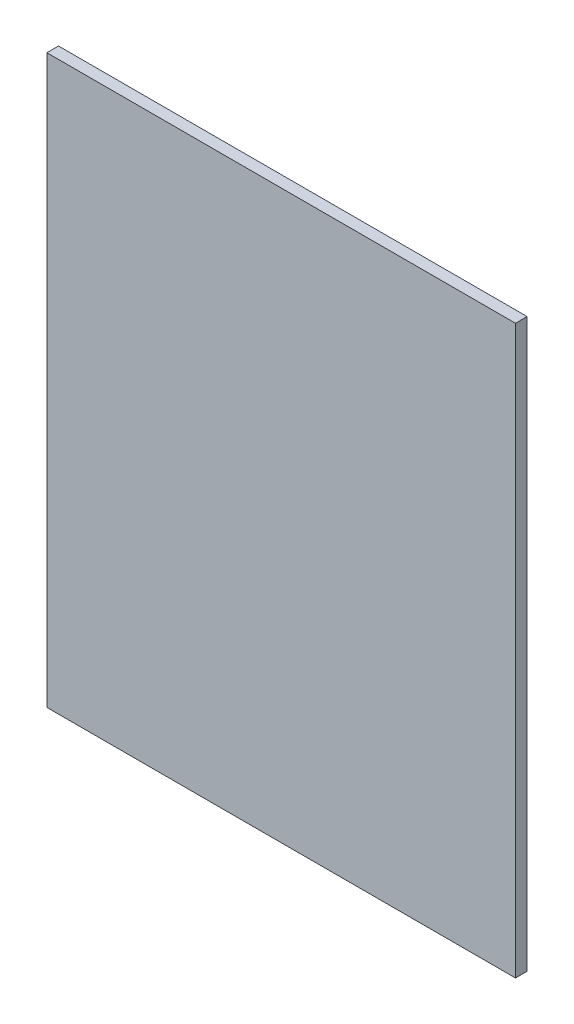
ISO-10303-21;
HEADER;
FILE_DESCRIPTION(('STEP AP214'),'2;1');
FILE_NAME('part.step','',(''),(''),'','','');
FILE_SCHEMA(('AUTOMOTIVE_DESIGN { 1 0 10303 214 1 1 1 1 }'));
ENDSEC;
DATA;
#1=APPLICATION_CONTEXT('core data for automotive mechanical design processes');
#2=APPLICATION_PROTOCOL_DEFINITION('international standard','automotive_design',2000,#1);
#3=PRODUCT_CONTEXT('',#1,'mechanical');
#4=PRODUCT('Part','Part','',(#3));
#5=PRODUCT_RELATED_PRODUCT_CATEGORY('part','',(#4));
#6=PRODUCT_DEFINITION_FORMATION('','',#4);
#7=PRODUCT_DEFINITION_CONTEXT('part definition',#1,'design');
#8=PRODUCT_DEFINITION('design','',#6,#7);
#9=PRODUCT_DEFINITION_SHAPE('','',#8);
#10=(LENGTH_UNIT() NAMED_UNIT(*) SI_UNIT(.MILLI.,.METRE.));
#11=(NAMED_UNIT(*) PLANE_ANGLE_UNIT() SI_UNIT($,.RADIAN.));
#12=(NAMED_UNIT(*) SI_UNIT($,.STERADIAN.) SOLID_ANGLE_UNIT());
#13=UNCERTAINTY_MEASURE_WITH_UNIT(LENGTH_MEASURE(1.E-05),#10,'distance_accuracy_value','');
#14=(GEOMETRIC_REPRESENTATION_CONTEXT(3) GLOBAL_UNCERTAINTY_ASSIGNED_CONTEXT((#13)) GLOBAL_UNIT_ASSIGNED_CONTEXT((#10,
#11,#12)) REPRESENTATION_CONTEXT('',''));
#15=CARTESIAN_POINT('',(0.,0.,0.));
#16=DIRECTION('',(0.,0.,1.));
#17=DIRECTION('',(1.,0.,0.));
#18=AXIS2_PLACEMENT_3D('',#15,#16,#17);
#19=CARTESIAN_POINT('',(797.573677161779,532.387927429448,3.));
#20=DIRECTION('',(1.,0.,0.));
#21=DIRECTION('',(0.,0.,-1.));
#22=AXIS2_PLACEMENT_3D('',#19,#20,#21);
#23=PLANE('',#22);
#24=DIRECTION('',(0.,-1.,0.));
#25=VECTOR('',#24,1.);
#26=CARTESIAN_POINT('',(797.573677161779,532.387927429448,0.));
#27=LINE('',#26,#25);
#28=CARTESIAN_POINT('',(797.573677161779,678.788447429448,0.));
#29=VERTEX_POINT('',#28);
#30=CARTESIAN_POINT('',(797.573677161779,532.387927429448,0.));
#31=VERTEX_POINT('',#30);
#32=EDGE_CURVE('E104',#29,#31,#27,.T.);
#33=ORIENTED_EDGE('',*,*,#32,.T.);
#34=DIRECTION('',(0.,0.,-1.));
#35=VECTOR('',#34,1.);
#36=CARTESIAN_POINT('',(797.573677161779,532.387927429448,3.));
#37=LINE('',#36,#35);
#38=CARTESIAN_POINT('',(797.573677161779,532.387927429448,3.));
#39=VERTEX_POINT('',#38);
#40=EDGE_CURVE('E11',#39,#31,#37,.T.);
#41=ORIENTED_EDGE('',*,*,#40,.F.);
#42=DIRECTION('',(0.,-1.,0.));
#43=VECTOR('',#42,1.);
#44=CARTESIAN_POINT('',(797.573677161779,532.387927429448,3.));
#45=LINE('',#44,#43);
#46=CARTESIAN_POINT('',(797.573677161779,678.788447429448,3.));
#47=VERTEX_POINT('',#46);
#48=EDGE_CURVE('E92',#47,#39,#45,.T.);
#49=ORIENTED_EDGE('',*,*,#48,.F.);
#50=DIRECTION('',(0.,0.,-1.));
#51=VECTOR('',#50,1.);
#52=CARTESIAN_POINT('',(797.573677161779,678.788447429448,3.));
#53=LINE('',#52,#51);
#54=EDGE_CURVE('E100',#47,#29,#53,.T.);
#55=ORIENTED_EDGE('',*,*,#54,.T.);
#56=EDGE_LOOP('',(#33,#41,#49,#55));
#57=FACE_BOUND('',#56,.T.);
#58=ADVANCED_FACE('F41',(#57),#23,.F.);
#59=CARTESIAN_POINT('',(918.574197161779,532.387927429448,3.));
#60=DIRECTION('',(0.,1.,0.));
#61=DIRECTION('',(0.,0.,1.));
#62=AXIS2_PLACEMENT_3D('',#59,#60,#61);
#63=PLANE('',#62);
#64=DIRECTION('',(1.,0.,0.));
#65=VECTOR('',#64,1.);
#66=CARTESIAN_POINT('',(918.574197161779,532.387927429448,0.));
#67=LINE('',#66,#65);
#68=CARTESIAN_POINT('',(918.574197161779,532.387927429448,0.));
#69=VERTEX_POINT('',#68);
#70=EDGE_CURVE('E96',#31,#69,#67,.T.);
#71=ORIENTED_EDGE('',*,*,#70,.T.);
#72=DIRECTION('',(0.,0.,-1.));
#73=VECTOR('',#72,1.);
#74=CARTESIAN_POINT('',(918.574197161779,532.387927429448,3.));
#75=LINE('',#74,#73);
#76=CARTESIAN_POINT('',(918.574197161779,532.387927429448,3.));
#77=VERTEX_POINT('',#76);
#78=EDGE_CURVE('E49',#77,#69,#75,.T.);
#79=ORIENTED_EDGE('',*,*,#78,.F.);
#80=DIRECTION('',(1.,0.,0.));
#81=VECTOR('',#80,1.);
#82=CARTESIAN_POINT('',(918.574197161779,532.387927429448,3.));
#83=LINE('',#82,#81);
#84=EDGE_CURVE('E87',#39,#77,#83,.T.);
#85=ORIENTED_EDGE('',*,*,#84,.F.);
#86=ORIENTED_EDGE('',*,*,#40,.T.);
#87=EDGE_LOOP('',(#71,#79,#85,#86));
#88=FACE_BOUND('',#87,.T.);
#89=ADVANCED_FACE('F95',(#88),#63,.F.);
#90=CARTESIAN_POINT('',(918.574197161779,678.788447429448,3.));
#91=DIRECTION('',(-1.,0.,0.));
#92=DIRECTION('',(0.,0.,1.));
#93=AXIS2_PLACEMENT_3D('',#90,#91,#92);
#94=PLANE('',#93);
#95=DIRECTION('',(0.,1.,0.));
#96=VECTOR('',#95,1.);
#97=CARTESIAN_POINT('',(918.574197161779,678.788447429448,0.));
#98=LINE('',#97,#96);
#99=CARTESIAN_POINT('',(918.574197161779,678.788447429448,0.));
#100=VERTEX_POINT('',#99);
#101=EDGE_CURVE('E74',#69,#100,#98,.T.);
#102=ORIENTED_EDGE('',*,*,#101,.T.);
#103=DIRECTION('',(0.,0.,-1.));
#104=VECTOR('',#103,1.);
#105=CARTESIAN_POINT('',(918.574197161779,678.788447429448,3.));
#106=LINE('',#105,#104);
#107=CARTESIAN_POINT('',(918.574197161779,678.788447429448,3.));
#108=VERTEX_POINT('',#107);
#109=EDGE_CURVE('E97',#108,#100,#106,.T.);
#110=ORIENTED_EDGE('',*,*,#109,.F.);
#111=DIRECTION('',(0.,1.,0.));
#112=VECTOR('',#111,1.);
#113=CARTESIAN_POINT('',(918.574197161779,678.788447429448,3.));
#114=LINE('',#113,#112);
#115=EDGE_CURVE('E90',#77,#108,#114,.T.);
#116=ORIENTED_EDGE('',*,*,#115,.F.);
#117=ORIENTED_EDGE('',*,*,#78,.T.);
#118=EDGE_LOOP('',(#102,#110,#116,#117));
#119=FACE_BOUND('',#118,.T.);
#120=ADVANCED_FACE('F98',(#119),#94,.F.);
#121=CARTESIAN_POINT('',(797.573677161779,678.788447429448,3.));
#122=DIRECTION('',(0.,-1.,0.));
#123=DIRECTION('',(0.,0.,-1.));
#124=AXIS2_PLACEMENT_3D('',#121,#122,#123);
#125=PLANE('',#124);
#126=DIRECTION('',(-1.,0.,0.));
#127=VECTOR('',#126,1.);
#128=CARTESIAN_POINT('',(797.573677161779,678.788447429448,0.));
#129=LINE('',#128,#127);
#130=EDGE_CURVE('E80',#100,#29,#129,.T.);
#131=ORIENTED_EDGE('',*,*,#130,.T.);
#132=ORIENTED_EDGE('',*,*,#54,.F.);
#133=DIRECTION('',(-1.,0.,0.));
#134=VECTOR('',#133,1.);
#135=CARTESIAN_POINT('',(797.573677161779,678.788447429448,3.));
#136=LINE('',#135,#134);
#137=EDGE_CURVE('E57',#108,#47,#136,.T.);
#138=ORIENTED_EDGE('',*,*,#137,.F.);
#139=ORIENTED_EDGE('',*,*,#109,.T.);
#140=EDGE_LOOP('',(#131,#132,#138,#139));
#141=FACE_BOUND('',#140,.T.);
#142=ADVANCED_FACE('F111',(#141),#125,.F.);
#143=CARTESIAN_POINT('',(0.,0.,3.));
#144=DIRECTION('',(0.,0.,-1.));
#145=DIRECTION('',(-1.,0.,0.));
#146=AXIS2_PLACEMENT_3D('',#143,#144,#145);
#147=PLANE('',#146);
#148=ORIENTED_EDGE('',*,*,#48,.T.);
#149=ORIENTED_EDGE('',*,*,#84,.T.);
#150=ORIENTED_EDGE('',*,*,#115,.T.);
#151=ORIENTED_EDGE('',*,*,#137,.T.);
#152=EDGE_LOOP('',(#148,#149,#150,#151));
#153=FACE_BOUND('',#152,.T.);
#154=ADVANCED_FACE('F88',(#153),#147,.F.);
#155=CARTESIAN_POINT('',(0.,0.,0.));
#156=DIRECTION('',(0.,0.,-1.));
#157=DIRECTION('',(-1.,0.,0.));
#158=AXIS2_PLACEMENT_3D('',#155,#156,#157);
#159=PLANE('',#158);
#160=ORIENTED_EDGE('',*,*,#32,.F.);
#161=ORIENTED_EDGE('',*,*,#130,.F.);
#162=ORIENTED_EDGE('',*,*,#101,.F.);
#163=ORIENTED_EDGE('',*,*,#70,.F.);
#164=EDGE_LOOP('',(#160,#161,#162,#163));
#165=FACE_BOUND('',#164,.T.);
#166=ADVANCED_FACE('F114',(#165),#159,.T.);
#167=CLOSED_SHELL('',(#58,#89,#120,#142,#154,#166));
#168=MANIFOLD_SOLID_BREP('B2',#167);
#169=ADVANCED_BREP_SHAPE_REPRESENTATION('',(#18,#168),#14);
#170=SHAPE_DEFINITION_REPRESENTATION(#9,#169);
ENDSEC;
END-ISO-10303-21;
